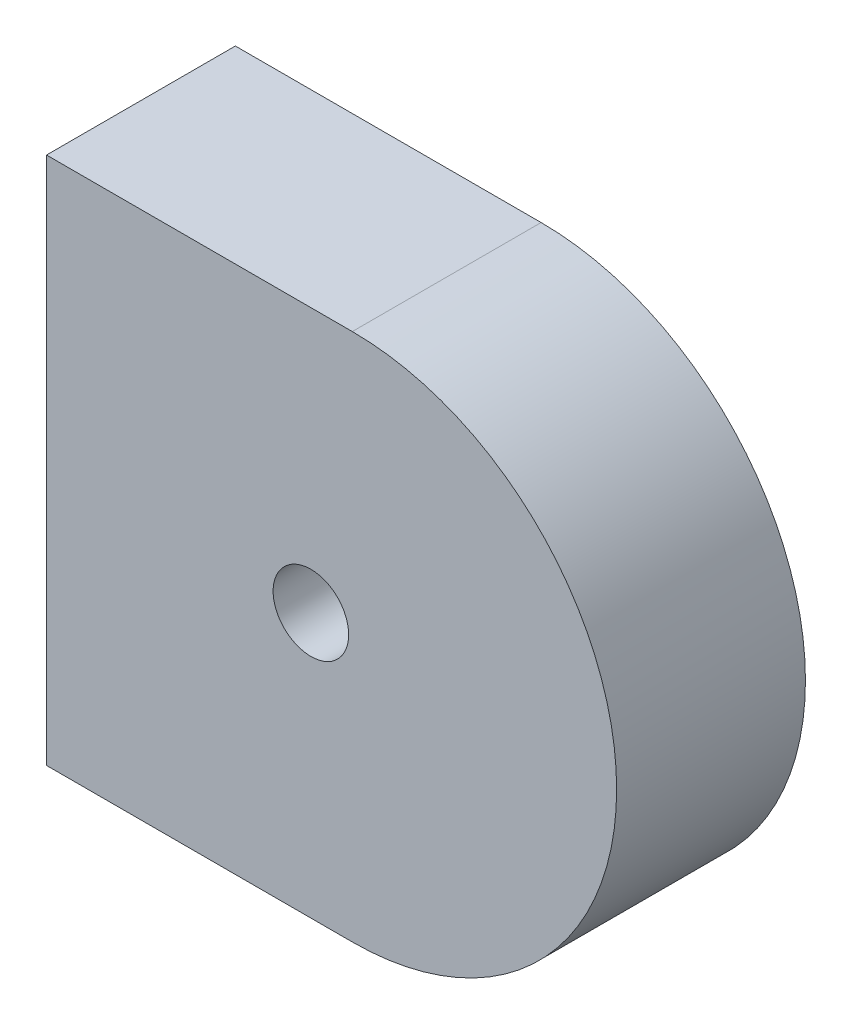
ISO-10303-21;
HEADER;
FILE_DESCRIPTION(('STEP AP214'),'2;1');
FILE_NAME('part.step','',(''),(''),'','','');
FILE_SCHEMA(('AUTOMOTIVE_DESIGN { 1 0 10303 214 1 1 1 1 }'));
ENDSEC;
DATA;
#1=APPLICATION_CONTEXT('core data for automotive mechanical design processes');
#2=APPLICATION_PROTOCOL_DEFINITION('international standard','automotive_design',2000,#1);
#3=PRODUCT_CONTEXT('',#1,'mechanical');
#4=PRODUCT('Part','Part','',(#3));
#5=PRODUCT_RELATED_PRODUCT_CATEGORY('part','',(#4));
#6=PRODUCT_DEFINITION_FORMATION('','',#4);
#7=PRODUCT_DEFINITION_CONTEXT('part definition',#1,'design');
#8=PRODUCT_DEFINITION('design','',#6,#7);
#9=PRODUCT_DEFINITION_SHAPE('','',#8);
#10=(LENGTH_UNIT() NAMED_UNIT(*) SI_UNIT(.MILLI.,.METRE.));
#11=(NAMED_UNIT(*) PLANE_ANGLE_UNIT() SI_UNIT($,.RADIAN.));
#12=(NAMED_UNIT(*) SI_UNIT($,.STERADIAN.) SOLID_ANGLE_UNIT());
#13=UNCERTAINTY_MEASURE_WITH_UNIT(LENGTH_MEASURE(1.E-05),#10,'distance_accuracy_value','');
#14=(GEOMETRIC_REPRESENTATION_CONTEXT(3) GLOBAL_UNCERTAINTY_ASSIGNED_CONTEXT((#13)) GLOBAL_UNIT_ASSIGNED_CONTEXT((#10,
#11,#12)) REPRESENTATION_CONTEXT('',''));
#15=CARTESIAN_POINT('',(0.,0.,0.));
#16=DIRECTION('',(0.,0.,1.));
#17=DIRECTION('',(1.,0.,0.));
#18=AXIS2_PLACEMENT_3D('',#15,#16,#17);
#19=CARTESIAN_POINT('',(0.,14.,5.));
#20=DIRECTION('',(0.,-1.,0.));
#21=DIRECTION('',(0.,0.,-1.));
#22=AXIS2_PLACEMENT_3D('',#19,#20,#21);
#23=PLANE('',#22);
#24=DIRECTION('',(-1.,0.,0.));
#25=VECTOR('',#24,1.);
#26=CARTESIAN_POINT('',(0.,14.,0.));
#27=LINE('',#26,#25);
#28=CARTESIAN_POINT('',(8.09677419354838,14.,0.));
#29=VERTEX_POINT('',#28);
#30=CARTESIAN_POINT('',(0.,14.,0.));
#31=VERTEX_POINT('',#30);
#32=EDGE_CURVE('E95',#29,#31,#27,.T.);
#33=ORIENTED_EDGE('',*,*,#32,.T.);
#34=DIRECTION('',(0.,0.,-1.));
#35=VECTOR('',#34,1.);
#36=CARTESIAN_POINT('',(0.,14.,5.));
#37=LINE('',#36,#35);
#38=CARTESIAN_POINT('',(0.,14.,5.));
#39=VERTEX_POINT('',#38);
#40=EDGE_CURVE('E11',#39,#31,#37,.T.);
#41=ORIENTED_EDGE('',*,*,#40,.F.);
#42=DIRECTION('',(-1.,0.,0.));
#43=VECTOR('',#42,1.);
#44=CARTESIAN_POINT('',(0.,14.,5.));
#45=LINE('',#44,#43);
#46=CARTESIAN_POINT('',(8.09677419354838,14.,5.));
#47=VERTEX_POINT('',#46);
#48=EDGE_CURVE('E83',#47,#39,#45,.T.);
#49=ORIENTED_EDGE('',*,*,#48,.F.);
#50=DIRECTION('',(0.,0.,-1.));
#51=VECTOR('',#50,1.);
#52=CARTESIAN_POINT('',(8.09677419354838,14.,5.));
#53=LINE('',#52,#51);
#54=EDGE_CURVE('E91',#47,#29,#53,.T.);
#55=ORIENTED_EDGE('',*,*,#54,.T.);
#56=EDGE_LOOP('',(#33,#41,#49,#55));
#57=FACE_BOUND('',#56,.T.);
#58=ADVANCED_FACE('F32',(#57),#23,.F.);
#59=CARTESIAN_POINT('',(0.,14.,5.));
#60=DIRECTION('',(1.,0.,0.));
#61=DIRECTION('',(0.,0.,-1.));
#62=AXIS2_PLACEMENT_3D('',#59,#60,#61);
#63=PLANE('',#62);
#64=DIRECTION('',(0.,-1.,0.));
#65=VECTOR('',#64,1.);
#66=CARTESIAN_POINT('',(0.,14.,0.));
#67=LINE('',#66,#65);
#68=CARTESIAN_POINT('',(0.,0.,0.));
#69=VERTEX_POINT('',#68);
#70=EDGE_CURVE('E87',#31,#69,#67,.T.);
#71=ORIENTED_EDGE('',*,*,#70,.T.);
#72=DIRECTION('',(0.,0.,-1.));
#73=VECTOR('',#72,1.);
#74=CARTESIAN_POINT('',(0.,0.,5.));
#75=LINE('',#74,#73);
#76=CARTESIAN_POINT('',(0.,0.,5.));
#77=VERTEX_POINT('',#76);
#78=EDGE_CURVE('E40',#77,#69,#75,.T.);
#79=ORIENTED_EDGE('',*,*,#78,.F.);
#80=DIRECTION('',(0.,-1.,0.));
#81=VECTOR('',#80,1.);
#82=CARTESIAN_POINT('',(0.,14.,5.));
#83=LINE('',#82,#81);
#84=EDGE_CURVE('E78',#39,#77,#83,.T.);
#85=ORIENTED_EDGE('',*,*,#84,.F.);
#86=ORIENTED_EDGE('',*,*,#40,.T.);
#87=EDGE_LOOP('',(#71,#79,#85,#86));
#88=FACE_BOUND('',#87,.T.);
#89=ADVANCED_FACE('F86',(#88),#63,.F.);
#90=CARTESIAN_POINT('',(0.,0.,5.));
#91=DIRECTION('',(0.,1.,0.));
#92=DIRECTION('',(0.,0.,1.));
#93=AXIS2_PLACEMENT_3D('',#90,#91,#92);
#94=PLANE('',#93);
#95=DIRECTION('',(1.,0.,0.));
#96=VECTOR('',#95,1.);
#97=CARTESIAN_POINT('',(0.,0.,0.));
#98=LINE('',#97,#96);
#99=CARTESIAN_POINT('',(8.09677419354838,0.,0.));
#100=VERTEX_POINT('',#99);
#101=EDGE_CURVE('E65',#69,#100,#98,.T.);
#102=ORIENTED_EDGE('',*,*,#101,.T.);
#103=DIRECTION('',(0.,0.,-1.));
#104=VECTOR('',#103,1.);
#105=CARTESIAN_POINT('',(8.09677419354838,0.,5.));
#106=LINE('',#105,#104);
#107=CARTESIAN_POINT('',(8.09677419354838,0.,5.));
#108=VERTEX_POINT('',#107);
#109=EDGE_CURVE('E88',#108,#100,#106,.T.);
#110=ORIENTED_EDGE('',*,*,#109,.F.);
#111=DIRECTION('',(1.,0.,0.));
#112=VECTOR('',#111,1.);
#113=CARTESIAN_POINT('',(0.,0.,5.));
#114=LINE('',#113,#112);
#115=EDGE_CURVE('E81',#77,#108,#114,.T.);
#116=ORIENTED_EDGE('',*,*,#115,.F.);
#117=ORIENTED_EDGE('',*,*,#78,.T.);
#118=EDGE_LOOP('',(#102,#110,#116,#117));
#119=FACE_BOUND('',#118,.T.);
#120=ADVANCED_FACE('F89',(#119),#94,.F.);
#121=CARTESIAN_POINT('',(8.09677419354838,7.,5.));
#122=DIRECTION('',(0.,0.,-1.));
#123=DIRECTION('',(-1.,0.,0.));
#124=AXIS2_PLACEMENT_3D('',#121,#122,#123);
#125=CYLINDRICAL_SURFACE('',#124,7.);
#126=CARTESIAN_POINT('',(8.09677419354838,7.,0.));
#127=DIRECTION('',(0.,0.,1.));
#128=DIRECTION('',(-1.,0.,0.));
#129=AXIS2_PLACEMENT_3D('',#126,#127,#128);
#130=CIRCLE('',#129,7.);
#131=EDGE_CURVE('E71',#100,#29,#130,.T.);
#132=ORIENTED_EDGE('',*,*,#131,.T.);
#133=ORIENTED_EDGE('',*,*,#54,.F.);
#134=CARTESIAN_POINT('',(8.09677419354838,7.,5.));
#135=DIRECTION('',(0.,0.,1.));
#136=DIRECTION('',(-1.,0.,0.));
#137=AXIS2_PLACEMENT_3D('',#134,#135,#136);
#138=CIRCLE('',#137,7.);
#139=EDGE_CURVE('E48',#108,#47,#138,.T.);
#140=ORIENTED_EDGE('',*,*,#139,.F.);
#141=ORIENTED_EDGE('',*,*,#109,.T.);
#142=EDGE_LOOP('',(#132,#133,#140,#141));
#143=FACE_BOUND('',#142,.T.);
#144=ADVANCED_FACE('F103',(#143),#125,.T.);
#145=CARTESIAN_POINT('',(8.09677419354838,7.,5.));
#146=DIRECTION('',(0.,0.,-1.));
#147=DIRECTION('',(-1.,0.,0.));
#148=AXIS2_PLACEMENT_3D('',#145,#146,#147);
#149=PLANE('',#148);
#150=CARTESIAN_POINT('',(7.,7.,5.));
#151=DIRECTION('',(0.,0.,1.));
#152=DIRECTION('',(1.,0.,0.));
#153=AXIS2_PLACEMENT_3D('',#150,#151,#152);
#154=CIRCLE('',#153,1.);
#155=CARTESIAN_POINT('',(8.,7.,5.));
#156=VERTEX_POINT('',#155);
#157=EDGE_CURVE('E111',#156,#156,#154,.T.);
#158=ORIENTED_EDGE('',*,*,#157,.F.);
#159=EDGE_LOOP('',(#158));
#160=FACE_BOUND('',#159,.T.);
#161=ORIENTED_EDGE('',*,*,#48,.T.);
#162=ORIENTED_EDGE('',*,*,#84,.T.);
#163=ORIENTED_EDGE('',*,*,#115,.T.);
#164=ORIENTED_EDGE('',*,*,#139,.T.);
#165=EDGE_LOOP('',(#161,#162,#163,#164));
#166=FACE_BOUND('',#165,.T.);
#167=ADVANCED_FACE('F79',(#160,#166),#149,.F.);
#168=CARTESIAN_POINT('',(8.09677419354838,7.,0.));
#169=DIRECTION('',(0.,0.,-1.));
#170=DIRECTION('',(-1.,0.,0.));
#171=AXIS2_PLACEMENT_3D('',#168,#169,#170);
#172=PLANE('',#171);
#173=CARTESIAN_POINT('',(7.,7.,0.));
#174=DIRECTION('',(0.,0.,1.));
#175=DIRECTION('',(1.,0.,0.));
#176=AXIS2_PLACEMENT_3D('',#173,#174,#175);
#177=CIRCLE('',#176,0.999999999999998);
#178=CARTESIAN_POINT('',(8.,7.,0.));
#179=VERTEX_POINT('',#178);
#180=EDGE_CURVE('E98',#179,#179,#177,.T.);
#181=ORIENTED_EDGE('',*,*,#180,.T.);
#182=EDGE_LOOP('',(#181));
#183=FACE_BOUND('',#182,.T.);
#184=ORIENTED_EDGE('',*,*,#32,.F.);
#185=ORIENTED_EDGE('',*,*,#131,.F.);
#186=ORIENTED_EDGE('',*,*,#101,.F.);
#187=ORIENTED_EDGE('',*,*,#70,.F.);
#188=EDGE_LOOP('',(#184,#185,#186,#187));
#189=FACE_BOUND('',#188,.T.);
#190=ADVANCED_FACE('F106',(#183,#189),#172,.T.);
#191=CARTESIAN_POINT('',(7.,7.,5.));
#192=DIRECTION('',(0.,0.,1.));
#193=DIRECTION('',(1.,0.,0.));
#194=AXIS2_PLACEMENT_3D('',#191,#192,#193);
#195=CYLINDRICAL_SURFACE('',#194,0.999999999999999);
#196=ORIENTED_EDGE('',*,*,#180,.F.);
#197=EDGE_LOOP('',(#196));
#198=FACE_BOUND('',#197,.T.);
#199=ORIENTED_EDGE('',*,*,#157,.T.);
#200=EDGE_LOOP('',(#199));
#201=FACE_BOUND('',#200,.T.);
#202=ADVANCED_FACE('F115',(#198,#201),#195,.F.);
#203=CLOSED_SHELL('',(#58,#89,#120,#144,#167,#190,#202));
#204=MANIFOLD_SOLID_BREP('B2',#203);
#205=ADVANCED_BREP_SHAPE_REPRESENTATION('',(#18,#204),#14);
#206=SHAPE_DEFINITION_REPRESENTATION(#9,#205);
ENDSEC;
END-ISO-10303-21;
